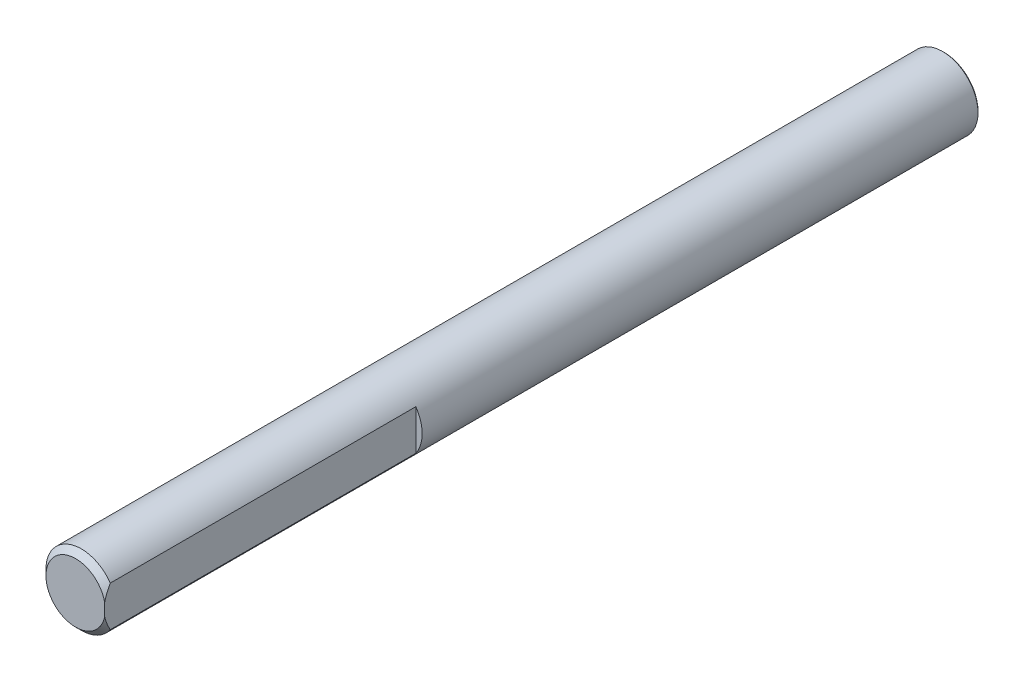
ISO-10303-21;
HEADER;
FILE_DESCRIPTION(('STEP AP214'),'2;1');
FILE_NAME('part.step','',(''),(''),'','','');
FILE_SCHEMA(('AUTOMOTIVE_DESIGN { 1 0 10303 214 1 1 1 1 }'));
ENDSEC;
DATA;
#1=APPLICATION_CONTEXT('core data for automotive mechanical design processes');
#2=APPLICATION_PROTOCOL_DEFINITION('international standard','automotive_design',2000,#1);
#3=PRODUCT_CONTEXT('',#1,'mechanical');
#4=PRODUCT('Part','Part','',(#3));
#5=PRODUCT_RELATED_PRODUCT_CATEGORY('part','',(#4));
#6=PRODUCT_DEFINITION_FORMATION('','',#4);
#7=PRODUCT_DEFINITION_CONTEXT('part definition',#1,'design');
#8=PRODUCT_DEFINITION('design','',#6,#7);
#9=PRODUCT_DEFINITION_SHAPE('','',#8);
#10=(LENGTH_UNIT() NAMED_UNIT(*) SI_UNIT(.MILLI.,.METRE.));
#11=(NAMED_UNIT(*) PLANE_ANGLE_UNIT() SI_UNIT($,.RADIAN.));
#12=(NAMED_UNIT(*) SI_UNIT($,.STERADIAN.) SOLID_ANGLE_UNIT());
#13=UNCERTAINTY_MEASURE_WITH_UNIT(LENGTH_MEASURE(1.E-05),#10,'distance_accuracy_value','');
#14=(GEOMETRIC_REPRESENTATION_CONTEXT(3) GLOBAL_UNCERTAINTY_ASSIGNED_CONTEXT((#13)) GLOBAL_UNIT_ASSIGNED_CONTEXT((#10,
#11,#12)) REPRESENTATION_CONTEXT('',''));
#15=CARTESIAN_POINT('',(0.,0.,0.));
#16=DIRECTION('',(0.,0.,1.));
#17=DIRECTION('',(1.,0.,0.));
#18=AXIS2_PLACEMENT_3D('',#15,#16,#17);
#19=CARTESIAN_POINT('',(0.,0.,2.8));
#20=DIRECTION('',(0.,0.,-1.));
#21=DIRECTION('',(0.,-1.,0.));
#22=AXIS2_PLACEMENT_3D('',#19,#20,#21);
#23=PLANE('',#22);
#24=CARTESIAN_POINT('',(0.,0.,2.8));
#25=DIRECTION('',(0.,0.,-1.));
#26=DIRECTION('',(-1.,0.,0.));
#27=AXIS2_PLACEMENT_3D('',#24,#25,#26);
#28=CIRCLE('',#27,2.4);
#29=CARTESIAN_POINT('',(-2.4,0.,2.8));
#30=VERTEX_POINT('',#29);
#31=EDGE_CURVE('E142',#30,#30,#28,.T.);
#32=ORIENTED_EDGE('',*,*,#31,.T.);
#33=EDGE_LOOP('',(#32));
#34=FACE_BOUND('',#33,.T.);
#35=ADVANCED_FACE('F16',(#34),#23,.T.);
#36=CARTESIAN_POINT('',(2.05256343929954,-2.40534350866936,42.2));
#37=DIRECTION('',(-1.,0.,0.));
#38=DIRECTION('',(0.,0.,1.));
#39=AXIS2_PLACEMENT_3D('',#36,#37,#38);
#40=PLANE('',#39);
#41=DIRECTION('',(0.,0.,1.));
#42=VECTOR('',#41,1.);
#43=CARTESIAN_POINT('',(2.05256343929954,1.42722924845689,40.1));
#44=LINE('',#43,#42);
#45=CARTESIAN_POINT('',(2.05256343929954,1.42722924845689,42.2));
#46=VERTEX_POINT('',#45);
#47=CARTESIAN_POINT('',(2.05256343929954,1.4272292484569,63.8));
#48=VERTEX_POINT('',#47);
#49=EDGE_CURVE('E77',#46,#48,#44,.T.);
#50=ORIENTED_EDGE('',*,*,#49,.T.);
#51=CARTESIAN_POINT('',(2.05256343929954,1.42722924845691,63.8));
#52=CARTESIAN_POINT('',(2.05256343929954,1.34994788440689,63.8440611601257));
#53=CARTESIAN_POINT('',(2.05256343929954,1.27161045176966,63.8864222228746));
#54=CARTESIAN_POINT('',(2.05256343929954,1.11300894540967,63.9661071765906));
#55=CARTESIAN_POINT('',(2.05256343929954,1.03275898634522,64.0034593449784));
#56=CARTESIAN_POINT('',(2.05256343929954,0.869471860847052,64.0721015767708));
#57=CARTESIAN_POINT('',(2.05256343929954,0.78643015855687,64.1033811539376));
#58=CARTESIAN_POINT('',(2.05256343929954,0.617291441700965,64.1581282472945));
#59=CARTESIAN_POINT('',(2.05256343929954,0.531179169212472,64.1815481002842));
#60=CARTESIAN_POINT('',(2.05256343929954,0.443828038378357,64.2));
#61=B_SPLINE_CURVE_WITH_KNOTS('',3,(#51,#52,#53,#54,#55,#56,#57,#58,#59,#60),.UNSPECIFIED.,.F.,
.F.,(4,2,2,2,4),(0.,0.266964823405071,0.532352630477993,0.798194714463173,1.06562096446122),.UNSPECIFIED.);
#62=CARTESIAN_POINT('',(2.05256343929954,0.443828038378379,64.2));
#63=VERTEX_POINT('',#62);
#64=EDGE_CURVE('E33',#48,#63,#61,.T.);
#65=ORIENTED_EDGE('',*,*,#64,.T.);
#66=DIRECTION('',(0.,-1.,0.));
#67=VECTOR('',#66,1.);
#68=CARTESIAN_POINT('',(2.05256343929954,-2.40534350866936,64.2));
#69=LINE('',#68,#67);
#70=CARTESIAN_POINT('',(2.05256343929954,-0.44382803837838,64.2));
#71=VERTEX_POINT('',#70);
#72=EDGE_CURVE('E68',#63,#71,#69,.T.);
#73=ORIENTED_EDGE('',*,*,#72,.T.);
#74=CARTESIAN_POINT('',(2.05256343929954,-0.443828038378354,64.2));
#75=CARTESIAN_POINT('',(2.05256343929954,-0.531179169212466,64.1815481002842));
#76=CARTESIAN_POINT('',(2.05256343929954,-0.617291441700959,64.1581282472945));
#77=CARTESIAN_POINT('',(2.05256343929954,-0.786430158556864,64.1033811539376));
#78=CARTESIAN_POINT('',(2.05256343929954,-0.869471860847045,64.0721015767708));
#79=CARTESIAN_POINT('',(2.05256343929954,-1.03275898634521,64.0034593449784));
#80=CARTESIAN_POINT('',(2.05256343929954,-1.11300894540966,63.9661071765906));
#81=CARTESIAN_POINT('',(2.05256343929954,-1.27161045176964,63.8864222228746));
#82=CARTESIAN_POINT('',(2.05256343929954,-1.34994788440686,63.8440611601257));
#83=CARTESIAN_POINT('',(2.05256343929954,-1.42722924845689,63.8));
#84=B_SPLINE_CURVE_WITH_KNOTS('',3,(#74,#75,#76,#77,#78,#79,#80,#81,#82,#83),.UNSPECIFIED.,.F.,
.F.,(4,2,2,2,4),(0.,0.267426249998044,0.533268333983214,0.798656141056142,1.06562096446119),.UNSPECIFIED.);
#85=CARTESIAN_POINT('',(2.05256343929954,-1.42722924845689,63.8));
#86=VERTEX_POINT('',#85);
#87=EDGE_CURVE('E21',#71,#86,#84,.T.);
#88=ORIENTED_EDGE('',*,*,#87,.T.);
#89=DIRECTION('',(0.,0.,-1.));
#90=VECTOR('',#89,1.);
#91=CARTESIAN_POINT('',(2.05256343929954,-1.42722924845689,40.1));
#92=LINE('',#91,#90);
#93=CARTESIAN_POINT('',(2.05256343929954,-1.42722924845689,42.2));
#94=VERTEX_POINT('',#93);
#95=EDGE_CURVE('E10',#86,#94,#92,.T.);
#96=ORIENTED_EDGE('',*,*,#95,.T.);
#97=DIRECTION('',(0.,-1.,0.));
#98=VECTOR('',#97,1.);
#99=CARTESIAN_POINT('',(2.05256343929954,-2.40534350866936,42.2));
#100=LINE('',#99,#98);
#101=EDGE_CURVE('E76',#46,#94,#100,.T.);
#102=ORIENTED_EDGE('',*,*,#101,.F.);
#103=EDGE_LOOP('',(#50,#65,#73,#88,#96,#102));
#104=FACE_BOUND('',#103,.T.);
#105=ADVANCED_FACE('F18',(#104),#40,.F.);
#106=CARTESIAN_POINT('',(0.,0.,42.2));
#107=DIRECTION('',(0.,0.,-1.));
#108=DIRECTION('',(0.,-1.,0.));
#109=AXIS2_PLACEMENT_3D('',#106,#107,#108);
#110=PLANE('',#109);
#111=ORIENTED_EDGE('',*,*,#101,.T.);
#112=CARTESIAN_POINT('',(0.,0.,42.2));
#113=DIRECTION('',(0.,0.,1.));
#114=DIRECTION('',(-1.,0.,0.));
#115=AXIS2_PLACEMENT_3D('',#112,#113,#114);
#116=CIRCLE('',#115,2.5);
#117=EDGE_CURVE('E48',#94,#46,#116,.T.);
#118=ORIENTED_EDGE('',*,*,#117,.T.);
#119=EDGE_LOOP('',(#111,#118));
#120=FACE_BOUND('',#119,.T.);
#121=ADVANCED_FACE('F82',(#120),#110,.F.);
#122=CARTESIAN_POINT('',(0.,0.,64.2));
#123=DIRECTION('',(0.,0.,1.));
#124=DIRECTION('',(1.,0.,0.));
#125=AXIS2_PLACEMENT_3D('',#122,#123,#124);
#126=PLANE('',#125);
#127=ORIENTED_EDGE('',*,*,#72,.F.);
#128=CARTESIAN_POINT('',(0.,0.,64.2));
#129=DIRECTION('',(0.,0.,1.));
#130=DIRECTION('',(1.,0.,0.));
#131=AXIS2_PLACEMENT_3D('',#128,#129,#130);
#132=CIRCLE('',#131,2.1);
#133=EDGE_CURVE('E84',#63,#71,#132,.T.);
#134=ORIENTED_EDGE('',*,*,#133,.T.);
#135=EDGE_LOOP('',(#127,#134));
#136=FACE_BOUND('',#135,.T.);
#137=ADVANCED_FACE('F114',(#136),#126,.T.);
#138=CARTESIAN_POINT('',(0.,0.,64.2));
#139=DIRECTION('',(0.,0.,-1.));
#140=DIRECTION('',(-1.,0.,0.));
#141=AXIS2_PLACEMENT_3D('',#138,#139,#140);
#142=CONICAL_SURFACE('',#141,2.1,0.785398163397446);
#143=ORIENTED_EDGE('',*,*,#133,.F.);
#144=ORIENTED_EDGE('',*,*,#64,.F.);
#145=CARTESIAN_POINT('',(0.,0.,63.8));
#146=DIRECTION('',(0.,0.,-1.));
#147=DIRECTION('',(1.,0.,0.));
#148=AXIS2_PLACEMENT_3D('',#145,#146,#147);
#149=CIRCLE('',#148,2.5);
#150=EDGE_CURVE('E88',#86,#48,#149,.T.);
#151=ORIENTED_EDGE('',*,*,#150,.F.);
#152=ORIENTED_EDGE('',*,*,#87,.F.);
#153=EDGE_LOOP('',(#143,#144,#151,#152));
#154=FACE_BOUND('',#153,.T.);
#155=ADVANCED_FACE('F110',(#154),#142,.T.);
#156=CARTESIAN_POINT('',(0.,0.,40.1));
#157=DIRECTION('',(0.,0.,1.));
#158=DIRECTION('',(1.,0.,0.));
#159=AXIS2_PLACEMENT_3D('',#156,#157,#158);
#160=CYLINDRICAL_SURFACE('',#159,2.5);
#161=ORIENTED_EDGE('',*,*,#95,.F.);
#162=ORIENTED_EDGE('',*,*,#150,.T.);
#163=ORIENTED_EDGE('',*,*,#49,.F.);
#164=ORIENTED_EDGE('',*,*,#117,.F.);
#165=EDGE_LOOP('',(#161,#162,#163,#164));
#166=FACE_BOUND('',#165,.T.);
#167=CARTESIAN_POINT('',(0.,0.,2.9));
#168=DIRECTION('',(0.,0.,-1.));
#169=DIRECTION('',(1.,0.,0.));
#170=AXIS2_PLACEMENT_3D('',#167,#168,#169);
#171=CIRCLE('',#170,2.5);
#172=CARTESIAN_POINT('',(2.5,0.,2.9));
#173=VERTEX_POINT('',#172);
#174=EDGE_CURVE('E97',#173,#173,#171,.T.);
#175=ORIENTED_EDGE('',*,*,#174,.F.);
#176=EDGE_LOOP('',(#175));
#177=FACE_BOUND('',#176,.T.);
#178=ADVANCED_FACE('F86',(#166,#177),#160,.T.);
#179=CARTESIAN_POINT('',(0.,0.,2.8));
#180=DIRECTION('',(0.,0.,1.));
#181=DIRECTION('',(1.,0.,0.));
#182=AXIS2_PLACEMENT_3D('',#179,#180,#181);
#183=CONICAL_SURFACE('',#182,2.4,0.785398163397381);
#184=ORIENTED_EDGE('',*,*,#174,.T.);
#185=EDGE_LOOP('',(#184));
#186=FACE_BOUND('',#185,.T.);
#187=ORIENTED_EDGE('',*,*,#31,.F.);
#188=EDGE_LOOP('',(#187));
#189=FACE_BOUND('',#188,.T.);
#190=ADVANCED_FACE('F132',(#186,#189),#183,.T.);
#191=CLOSED_SHELL('',(#35,#105,#121,#137,#155,#178,#190));
#192=MANIFOLD_SOLID_BREP('B1',#191);
#193=ADVANCED_BREP_SHAPE_REPRESENTATION('',(#18,#192),#14);
#194=SHAPE_DEFINITION_REPRESENTATION(#9,#193);
ENDSEC;
END-ISO-10303-21;
